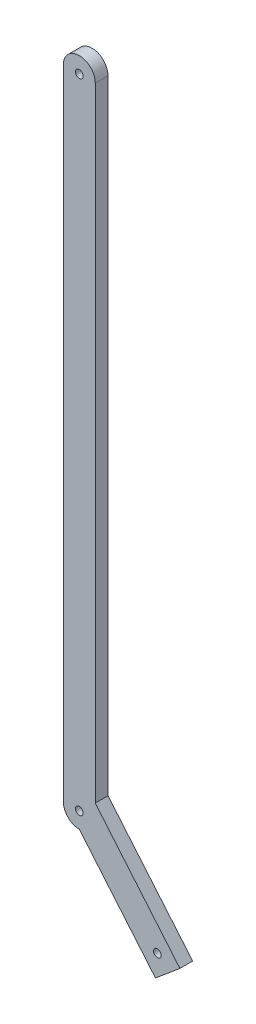
ISO-10303-21;
HEADER;
FILE_DESCRIPTION(('STEP AP214'),'2;1');
FILE_NAME('part.step','',(''),(''),'','','');
FILE_SCHEMA(('AUTOMOTIVE_DESIGN { 1 0 10303 214 1 1 1 1 }'));
ENDSEC;
DATA;
#1=APPLICATION_CONTEXT('core data for automotive mechanical design processes');
#2=APPLICATION_PROTOCOL_DEFINITION('international standard','automotive_design',2000,#1);
#3=PRODUCT_CONTEXT('',#1,'mechanical');
#4=PRODUCT('Part','Part','',(#3));
#5=PRODUCT_RELATED_PRODUCT_CATEGORY('part','',(#4));
#6=PRODUCT_DEFINITION_FORMATION('','',#4);
#7=PRODUCT_DEFINITION_CONTEXT('part definition',#1,'design');
#8=PRODUCT_DEFINITION('design','',#6,#7);
#9=PRODUCT_DEFINITION_SHAPE('','',#8);
#10=(LENGTH_UNIT() NAMED_UNIT(*) SI_UNIT(.MILLI.,.METRE.));
#11=(NAMED_UNIT(*) PLANE_ANGLE_UNIT() SI_UNIT($,.RADIAN.));
#12=(NAMED_UNIT(*) SI_UNIT($,.STERADIAN.) SOLID_ANGLE_UNIT());
#13=UNCERTAINTY_MEASURE_WITH_UNIT(LENGTH_MEASURE(1.E-05),#10,'distance_accuracy_value','');
#14=(GEOMETRIC_REPRESENTATION_CONTEXT(3) GLOBAL_UNCERTAINTY_ASSIGNED_CONTEXT((#13)) GLOBAL_UNIT_ASSIGNED_CONTEXT((#10,
#11,#12)) REPRESENTATION_CONTEXT('',''));
#15=CARTESIAN_POINT('',(0.,0.,0.));
#16=DIRECTION('',(0.,0.,1.));
#17=DIRECTION('',(1.,0.,0.));
#18=AXIS2_PLACEMENT_3D('',#15,#16,#17);
#19=CARTESIAN_POINT('',(0.,0.,10.));
#20=DIRECTION('',(0.,0.,1.));
#21=DIRECTION('',(1.,0.,0.));
#22=AXIS2_PLACEMENT_3D('',#19,#20,#21);
#23=PLANE('',#22);
#24=CARTESIAN_POINT('',(0.,-500.,10.));
#25=DIRECTION('',(0.,0.,1.));
#26=DIRECTION('',(-1.,0.,0.));
#27=AXIS2_PLACEMENT_3D('',#24,#25,#26);
#28=CIRCLE('',#27,12.4999999999999);
#29=CARTESIAN_POINT('',(-12.4999999999999,-500.,10.));
#30=VERTEX_POINT('',#29);
#31=CARTESIAN_POINT('',(0.,-512.5,10.));
#32=VERTEX_POINT('',#31);
#33=EDGE_CURVE('E113',#30,#32,#28,.T.);
#34=ORIENTED_EDGE('',*,*,#33,.T.);
#35=DIRECTION('',(0.642787609686533,-0.766044443118983,0.));
#36=VECTOR('',#35,1.);
#37=CARTESIAN_POINT('',(59.6594396288537,-583.599351509845,10.));
#38=LINE('',#37,#36);
#39=CARTESIAN_POINT('',(59.6594396288537,-583.599351509845,10.));
#40=VERTEX_POINT('',#39);
#41=EDGE_CURVE('E97',#32,#40,#38,.T.);
#42=ORIENTED_EDGE('',*,*,#41,.T.);
#43=DIRECTION('',(0.766044443118978,0.642787609686539,0.));
#44=VECTOR('',#43,1.);
#45=CARTESIAN_POINT('',(78.8105507068281,-567.529661267681,10.));
#46=LINE('',#45,#44);
#47=CARTESIAN_POINT('',(78.8105507068281,-567.529661267681,10.));
#48=VERTEX_POINT('',#47);
#49=EDGE_CURVE('E104',#40,#48,#46,.T.);
#50=ORIENTED_EDGE('',*,*,#49,.T.);
#51=DIRECTION('',(-0.642787609686534,0.766044443118982,0.));
#52=VECTOR('',#51,1.);
#53=CARTESIAN_POINT('',(12.4999999999999,-488.503824235917,10.));
#54=LINE('',#53,#52);
#55=CARTESIAN_POINT('',(12.4999999999999,-488.503824235917,10.));
#56=VERTEX_POINT('',#55);
#57=EDGE_CURVE('E110',#48,#56,#54,.T.);
#58=ORIENTED_EDGE('',*,*,#57,.T.);
#59=DIRECTION('',(0.,1.,0.));
#60=VECTOR('',#59,1.);
#61=CARTESIAN_POINT('',(12.5,0.,10.));
#62=LINE('',#61,#60);
#63=CARTESIAN_POINT('',(12.5,0.,10.));
#64=VERTEX_POINT('',#63);
#65=EDGE_CURVE('E150',#56,#64,#62,.T.);
#66=ORIENTED_EDGE('',*,*,#65,.T.);
#67=CARTESIAN_POINT('',(0.,0.,10.));
#68=DIRECTION('',(0.,0.,1.));
#69=DIRECTION('',(1.,0.,0.));
#70=AXIS2_PLACEMENT_3D('',#67,#68,#69);
#71=CIRCLE('',#70,12.5);
#72=CARTESIAN_POINT('',(-12.5,0.,10.));
#73=VERTEX_POINT('',#72);
#74=EDGE_CURVE('E143',#64,#73,#71,.T.);
#75=ORIENTED_EDGE('',*,*,#74,.T.);
#76=DIRECTION('',(0.,-1.,0.));
#77=VECTOR('',#76,1.);
#78=CARTESIAN_POINT('',(-12.5,0.,10.));
#79=LINE('',#78,#77);
#80=EDGE_CURVE('E146',#73,#30,#79,.T.);
#81=ORIENTED_EDGE('',*,*,#80,.T.);
#82=EDGE_LOOP('',(#34,#42,#50,#58,#66,#75,#81));
#83=FACE_BOUND('',#82,.T.);
#84=CARTESIAN_POINT('',(0.,0.,10.));
#85=DIRECTION('',(0.,0.,1.));
#86=DIRECTION('',(1.,0.,0.));
#87=AXIS2_PLACEMENT_3D('',#84,#85,#86);
#88=CIRCLE('',#87,3.);
#89=CARTESIAN_POINT('',(3.,0.,10.));
#90=VERTEX_POINT('',#89);
#91=EDGE_CURVE('E137',#90,#90,#88,.T.);
#92=ORIENTED_EDGE('',*,*,#91,.F.);
#93=EDGE_LOOP('',(#92));
#94=FACE_BOUND('',#93,.T.);
#95=CARTESIAN_POINT('',(0.,-500.,10.));
#96=DIRECTION('',(0.,0.,1.));
#97=DIRECTION('',(-1.,0.,0.));
#98=AXIS2_PLACEMENT_3D('',#95,#96,#97);
#99=CIRCLE('',#98,3.);
#100=CARTESIAN_POINT('',(-3.,-500.,10.));
#101=VERTEX_POINT('',#100);
#102=EDGE_CURVE('E131',#101,#101,#99,.T.);
#103=ORIENTED_EDGE('',*,*,#102,.F.);
#104=EDGE_LOOP('',(#103));
#105=FACE_BOUND('',#104,.T.);
#106=CARTESIAN_POINT('',(61.2001500467594,-565.988950849776,10.));
#107=DIRECTION('',(0.,0.,1.));
#108=DIRECTION('',(1.,0.,0.));
#109=AXIS2_PLACEMENT_3D('',#106,#107,#108);
#110=CIRCLE('',#109,2.99999999999964);
#111=CARTESIAN_POINT('',(64.200150046759,-565.988950849776,10.));
#112=VERTEX_POINT('',#111);
#113=EDGE_CURVE('E114',#112,#112,#110,.T.);
#114=ORIENTED_EDGE('',*,*,#113,.F.);
#115=EDGE_LOOP('',(#114));
#116=FACE_BOUND('',#115,.T.);
#117=ADVANCED_FACE('F32',(#83,#94,#105,#116),#23,.T.);
#118=CARTESIAN_POINT('',(0.,0.,0.));
#119=DIRECTION('',(0.,0.,1.));
#120=DIRECTION('',(1.,0.,0.));
#121=AXIS2_PLACEMENT_3D('',#118,#119,#120);
#122=PLANE('',#121);
#123=DIRECTION('',(0.,1.,0.));
#124=VECTOR('',#123,1.);
#125=CARTESIAN_POINT('',(12.5,0.,0.));
#126=LINE('',#125,#124);
#127=CARTESIAN_POINT('',(12.5,-488.503824235917,0.));
#128=VERTEX_POINT('',#127);
#129=CARTESIAN_POINT('',(12.5,0.,0.));
#130=VERTEX_POINT('',#129);
#131=EDGE_CURVE('E147',#128,#130,#126,.T.);
#132=ORIENTED_EDGE('',*,*,#131,.F.);
#133=DIRECTION('',(0.642787609686534,-0.766044443118982,0.));
#134=VECTOR('',#133,1.);
#135=CARTESIAN_POINT('',(12.4999999999999,-488.503824235917,0.));
#136=LINE('',#135,#134);
#137=CARTESIAN_POINT('',(78.8105507068281,-567.529661267681,0.));
#138=VERTEX_POINT('',#137);
#139=EDGE_CURVE('E167',#128,#138,#136,.T.);
#140=ORIENTED_EDGE('',*,*,#139,.T.);
#141=DIRECTION('',(-0.766044443118978,-0.642787609686539,0.));
#142=VECTOR('',#141,1.);
#143=CARTESIAN_POINT('',(78.8105507068281,-567.529661267681,0.));
#144=LINE('',#143,#142);
#145=CARTESIAN_POINT('',(59.6594396288537,-583.599351509845,0.));
#146=VERTEX_POINT('',#145);
#147=EDGE_CURVE('E124',#138,#146,#144,.T.);
#148=ORIENTED_EDGE('',*,*,#147,.T.);
#149=DIRECTION('',(-0.642787609686534,0.766044443118983,0.));
#150=VECTOR('',#149,1.);
#151=CARTESIAN_POINT('',(59.6594396288537,-583.599351509845,0.));
#152=LINE('',#151,#150);
#153=CARTESIAN_POINT('',(0.,-512.5,0.));
#154=VERTEX_POINT('',#153);
#155=EDGE_CURVE('E98',#146,#154,#152,.T.);
#156=ORIENTED_EDGE('',*,*,#155,.T.);
#157=CARTESIAN_POINT('',(0.,-500.,0.));
#158=DIRECTION('',(0.,0.,1.));
#159=DIRECTION('',(-1.,0.,0.));
#160=AXIS2_PLACEMENT_3D('',#157,#158,#159);
#161=CIRCLE('',#160,12.4999999999999);
#162=CARTESIAN_POINT('',(-12.4999999999999,-500.,0.));
#163=VERTEX_POINT('',#162);
#164=EDGE_CURVE('E52',#163,#154,#161,.T.);
#165=ORIENTED_EDGE('',*,*,#164,.F.);
#166=DIRECTION('',(0.,-1.,0.));
#167=VECTOR('',#166,1.);
#168=CARTESIAN_POINT('',(-12.5,0.,0.));
#169=LINE('',#168,#167);
#170=CARTESIAN_POINT('',(-12.5,0.,0.));
#171=VERTEX_POINT('',#170);
#172=EDGE_CURVE('E155',#171,#163,#169,.T.);
#173=ORIENTED_EDGE('',*,*,#172,.F.);
#174=CARTESIAN_POINT('',(0.,0.,0.));
#175=DIRECTION('',(0.,0.,1.));
#176=DIRECTION('',(1.,0.,0.));
#177=AXIS2_PLACEMENT_3D('',#174,#175,#176);
#178=CIRCLE('',#177,12.5);
#179=EDGE_CURVE('E140',#130,#171,#178,.T.);
#180=ORIENTED_EDGE('',*,*,#179,.F.);
#181=EDGE_LOOP('',(#132,#140,#148,#156,#165,#173,#180));
#182=FACE_BOUND('',#181,.T.);
#183=CARTESIAN_POINT('',(0.,0.,0.));
#184=DIRECTION('',(0.,0.,1.));
#185=DIRECTION('',(1.,0.,0.));
#186=AXIS2_PLACEMENT_3D('',#183,#184,#185);
#187=CIRCLE('',#186,3.);
#188=CARTESIAN_POINT('',(3.,0.,0.));
#189=VERTEX_POINT('',#188);
#190=EDGE_CURVE('E134',#189,#189,#187,.T.);
#191=ORIENTED_EDGE('',*,*,#190,.T.);
#192=EDGE_LOOP('',(#191));
#193=FACE_BOUND('',#192,.T.);
#194=CARTESIAN_POINT('',(0.,-500.,0.));
#195=DIRECTION('',(0.,0.,1.));
#196=DIRECTION('',(-1.,0.,0.));
#197=AXIS2_PLACEMENT_3D('',#194,#195,#196);
#198=CIRCLE('',#197,3.);
#199=CARTESIAN_POINT('',(-3.,-500.,0.));
#200=VERTEX_POINT('',#199);
#201=EDGE_CURVE('E130',#200,#200,#198,.T.);
#202=ORIENTED_EDGE('',*,*,#201,.T.);
#203=EDGE_LOOP('',(#202));
#204=FACE_BOUND('',#203,.T.);
#205=CARTESIAN_POINT('',(61.2001500467594,-565.988950849776,0.));
#206=DIRECTION('',(0.,0.,1.));
#207=DIRECTION('',(1.,0.,0.));
#208=AXIS2_PLACEMENT_3D('',#205,#206,#207);
#209=CIRCLE('',#208,2.99999999999964);
#210=CARTESIAN_POINT('',(64.200150046759,-565.988950849776,0.));
#211=VERTEX_POINT('',#210);
#212=EDGE_CURVE('E127',#211,#211,#209,.F.);
#213=ORIENTED_EDGE('',*,*,#212,.F.);
#214=EDGE_LOOP('',(#213));
#215=FACE_BOUND('',#214,.T.);
#216=ADVANCED_FACE('F164',(#182,#193,#204,#215),#122,.F.);
#217=CARTESIAN_POINT('',(0.,0.,10.));
#218=DIRECTION('',(0.,0.,-1.));
#219=DIRECTION('',(-1.,0.,0.));
#220=AXIS2_PLACEMENT_3D('',#217,#218,#219);
#221=CYLINDRICAL_SURFACE('',#220,12.5);
#222=ORIENTED_EDGE('',*,*,#179,.T.);
#223=DIRECTION('',(0.,0.,-1.));
#224=VECTOR('',#223,1.);
#225=CARTESIAN_POINT('',(-12.5,0.,10.));
#226=LINE('',#225,#224);
#227=EDGE_CURVE('E11',#73,#171,#226,.T.);
#228=ORIENTED_EDGE('',*,*,#227,.F.);
#229=ORIENTED_EDGE('',*,*,#74,.F.);
#230=DIRECTION('',(0.,0.,-1.));
#231=VECTOR('',#230,1.);
#232=CARTESIAN_POINT('',(12.5,0.,10.));
#233=LINE('',#232,#231);
#234=EDGE_CURVE('E152',#64,#130,#233,.T.);
#235=ORIENTED_EDGE('',*,*,#234,.T.);
#236=EDGE_LOOP('',(#222,#228,#229,#235));
#237=FACE_BOUND('',#236,.T.);
#238=ADVANCED_FACE('F34',(#237),#221,.T.);
#239=CARTESIAN_POINT('',(-12.5,0.,10.));
#240=DIRECTION('',(1.,0.,0.));
#241=DIRECTION('',(0.,1.,0.));
#242=AXIS2_PLACEMENT_3D('',#239,#240,#241);
#243=PLANE('',#242);
#244=ORIENTED_EDGE('',*,*,#172,.T.);
#245=DIRECTION('',(0.,0.,-1.));
#246=VECTOR('',#245,1.);
#247=CARTESIAN_POINT('',(-12.4999999999999,-500.,10.));
#248=LINE('',#247,#246);
#249=EDGE_CURVE('E40',#30,#163,#248,.T.);
#250=ORIENTED_EDGE('',*,*,#249,.F.);
#251=ORIENTED_EDGE('',*,*,#80,.F.);
#252=ORIENTED_EDGE('',*,*,#227,.T.);
#253=EDGE_LOOP('',(#244,#250,#251,#252));
#254=FACE_BOUND('',#253,.T.);
#255=ADVANCED_FACE('F180',(#254),#243,.F.);
#256=CARTESIAN_POINT('',(0.,-500.,10.));
#257=DIRECTION('',(0.,0.,-1.));
#258=DIRECTION('',(-1.,0.,0.));
#259=AXIS2_PLACEMENT_3D('',#256,#257,#258);
#260=CYLINDRICAL_SURFACE('',#259,12.4999999999999);
#261=ORIENTED_EDGE('',*,*,#164,.T.);
#262=DIRECTION('',(0.,0.,1.));
#263=VECTOR('',#262,1.);
#264=CARTESIAN_POINT('',(0.,-512.5,-123.508146331405));
#265=LINE('',#264,#263);
#266=EDGE_CURVE('E47',#154,#32,#265,.T.);
#267=ORIENTED_EDGE('',*,*,#266,.T.);
#268=ORIENTED_EDGE('',*,*,#33,.F.);
#269=ORIENTED_EDGE('',*,*,#249,.T.);
#270=EDGE_LOOP('',(#261,#267,#268,#269));
#271=FACE_BOUND('',#270,.T.);
#272=ADVANCED_FACE('F161',(#271),#260,.T.);
#273=CARTESIAN_POINT('',(12.5,0.,10.));
#274=DIRECTION('',(-1.,0.,0.));
#275=DIRECTION('',(0.,-1.,0.));
#276=AXIS2_PLACEMENT_3D('',#273,#274,#275);
#277=PLANE('',#276);
#278=ORIENTED_EDGE('',*,*,#65,.F.);
#279=DIRECTION('',(0.,0.,1.));
#280=VECTOR('',#279,1.);
#281=CARTESIAN_POINT('',(12.4999999999999,-488.503824235917,-123.508146331405));
#282=LINE('',#281,#280);
#283=EDGE_CURVE('E121',#128,#56,#282,.T.);
#284=ORIENTED_EDGE('',*,*,#283,.F.);
#285=ORIENTED_EDGE('',*,*,#131,.T.);
#286=ORIENTED_EDGE('',*,*,#234,.F.);
#287=EDGE_LOOP('',(#278,#284,#285,#286));
#288=FACE_BOUND('',#287,.T.);
#289=ADVANCED_FACE('F178',(#288),#277,.F.);
#290=CARTESIAN_POINT('',(0.,0.,10.));
#291=DIRECTION('',(0.,0.,-1.));
#292=DIRECTION('',(-1.,0.,0.));
#293=AXIS2_PLACEMENT_3D('',#290,#291,#292);
#294=CYLINDRICAL_SURFACE('',#293,3.);
#295=ORIENTED_EDGE('',*,*,#91,.T.);
#296=EDGE_LOOP('',(#295));
#297=FACE_BOUND('',#296,.T.);
#298=ORIENTED_EDGE('',*,*,#190,.F.);
#299=EDGE_LOOP('',(#298));
#300=FACE_BOUND('',#299,.T.);
#301=ADVANCED_FACE('F194',(#297,#300),#294,.F.);
#302=CARTESIAN_POINT('',(0.,-500.,10.));
#303=DIRECTION('',(0.,0.,-1.));
#304=DIRECTION('',(-1.,0.,0.));
#305=AXIS2_PLACEMENT_3D('',#302,#303,#304);
#306=CYLINDRICAL_SURFACE('',#305,3.);
#307=ORIENTED_EDGE('',*,*,#102,.T.);
#308=EDGE_LOOP('',(#307));
#309=FACE_BOUND('',#308,.T.);
#310=ORIENTED_EDGE('',*,*,#201,.F.);
#311=EDGE_LOOP('',(#310));
#312=FACE_BOUND('',#311,.T.);
#313=ADVANCED_FACE('F201',(#309,#312),#306,.F.);
#314=CARTESIAN_POINT('',(59.6594396288537,-583.599351509845,-123.508146331405));
#315=DIRECTION('',(-0.766044443118983,-0.642787609686533,0.));
#316=DIRECTION('',(0.642787609686534,-0.766044443118983,0.));
#317=AXIS2_PLACEMENT_3D('',#314,#315,#316);
#318=PLANE('',#317);
#319=ORIENTED_EDGE('',*,*,#155,.F.);
#320=DIRECTION('',(0.,0.,1.));
#321=VECTOR('',#320,1.);
#322=CARTESIAN_POINT('',(59.6594396288537,-583.599351509845,-123.508146331405));
#323=LINE('',#322,#321);
#324=EDGE_CURVE('E93',#146,#40,#323,.T.);
#325=ORIENTED_EDGE('',*,*,#324,.T.);
#326=ORIENTED_EDGE('',*,*,#41,.F.);
#327=ORIENTED_EDGE('',*,*,#266,.F.);
#328=EDGE_LOOP('',(#319,#325,#326,#327));
#329=FACE_BOUND('',#328,.T.);
#330=ADVANCED_FACE('F95',(#329),#318,.T.);
#331=CARTESIAN_POINT('',(78.8105507068281,-567.529661267681,-123.508146331405));
#332=DIRECTION('',(0.642787609686539,-0.766044443118978,0.));
#333=DIRECTION('',(0.766044443118978,0.642787609686539,0.));
#334=AXIS2_PLACEMENT_3D('',#331,#332,#333);
#335=PLANE('',#334);
#336=ORIENTED_EDGE('',*,*,#147,.F.);
#337=DIRECTION('',(0.,0.,1.));
#338=VECTOR('',#337,1.);
#339=CARTESIAN_POINT('',(78.8105507068281,-567.529661267681,-123.508146331405));
#340=LINE('',#339,#338);
#341=EDGE_CURVE('E101',#138,#48,#340,.T.);
#342=ORIENTED_EDGE('',*,*,#341,.T.);
#343=ORIENTED_EDGE('',*,*,#49,.F.);
#344=ORIENTED_EDGE('',*,*,#324,.F.);
#345=EDGE_LOOP('',(#336,#342,#343,#344));
#346=FACE_BOUND('',#345,.T.);
#347=ADVANCED_FACE('F105',(#346),#335,.T.);
#348=CARTESIAN_POINT('',(12.4999999999999,-488.503824235917,-123.508146331405));
#349=DIRECTION('',(0.766044443118982,0.642787609686534,0.));
#350=DIRECTION('',(-0.642787609686534,0.766044443118982,0.));
#351=AXIS2_PLACEMENT_3D('',#348,#349,#350);
#352=PLANE('',#351);
#353=ORIENTED_EDGE('',*,*,#139,.F.);
#354=ORIENTED_EDGE('',*,*,#283,.T.);
#355=ORIENTED_EDGE('',*,*,#57,.F.);
#356=ORIENTED_EDGE('',*,*,#341,.F.);
#357=EDGE_LOOP('',(#353,#354,#355,#356));
#358=FACE_BOUND('',#357,.T.);
#359=ADVANCED_FACE('F173',(#358),#352,.T.);
#360=CARTESIAN_POINT('',(61.2001500467594,-565.988950849776,-123.508146331405));
#361=DIRECTION('',(0.,0.,1.));
#362=DIRECTION('',(1.,0.,0.));
#363=AXIS2_PLACEMENT_3D('',#360,#361,#362);
#364=CYLINDRICAL_SURFACE('',#363,2.99999999999964);
#365=ORIENTED_EDGE('',*,*,#212,.T.);
#366=EDGE_LOOP('',(#365));
#367=FACE_BOUND('',#366,.T.);
#368=ORIENTED_EDGE('',*,*,#113,.T.);
#369=EDGE_LOOP('',(#368));
#370=FACE_BOUND('',#369,.T.);
#371=ADVANCED_FACE('F215',(#367,#370),#364,.F.);
#372=CLOSED_SHELL('',(#117,#216,#238,#255,#272,#289,#301,#313,#330,#347,#359,#371));
#373=MANIFOLD_SOLID_BREP('B2',#372);
#374=ADVANCED_BREP_SHAPE_REPRESENTATION('',(#18,#373),#14);
#375=SHAPE_DEFINITION_REPRESENTATION(#9,#374);
ENDSEC;
END-ISO-10303-21;
